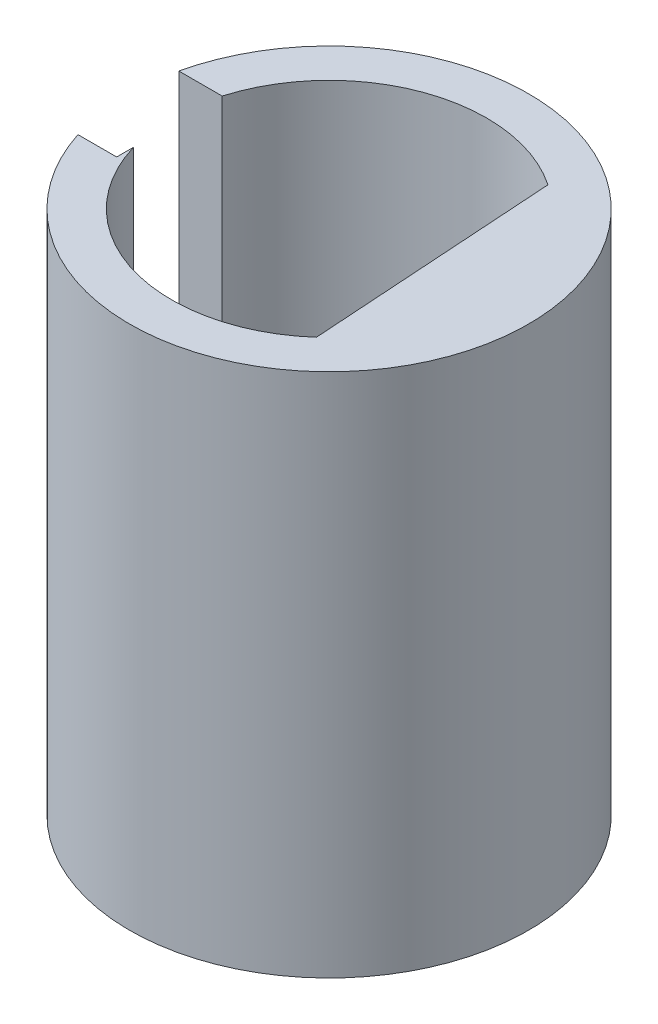
ISO-10303-21;
HEADER;
FILE_DESCRIPTION(('STEP AP214'),'2;1');
FILE_NAME('part.step','',(''),(''),'','','');
FILE_SCHEMA(('AUTOMOTIVE_DESIGN { 1 0 10303 214 1 1 1 1 }'));
ENDSEC;
DATA;
#1=APPLICATION_CONTEXT('core data for automotive mechanical design processes');
#2=APPLICATION_PROTOCOL_DEFINITION('international standard','automotive_design',2000,#1);
#3=PRODUCT_CONTEXT('',#1,'mechanical');
#4=PRODUCT('Part','Part','',(#3));
#5=PRODUCT_RELATED_PRODUCT_CATEGORY('part','',(#4));
#6=PRODUCT_DEFINITION_FORMATION('','',#4);
#7=PRODUCT_DEFINITION_CONTEXT('part definition',#1,'design');
#8=PRODUCT_DEFINITION('design','',#6,#7);
#9=PRODUCT_DEFINITION_SHAPE('','',#8);
#10=(LENGTH_UNIT() NAMED_UNIT(*) SI_UNIT(.MILLI.,.METRE.));
#11=(NAMED_UNIT(*) PLANE_ANGLE_UNIT() SI_UNIT($,.RADIAN.));
#12=(NAMED_UNIT(*) SI_UNIT($,.STERADIAN.) SOLID_ANGLE_UNIT());
#13=UNCERTAINTY_MEASURE_WITH_UNIT(LENGTH_MEASURE(1.E-05),#10,'distance_accuracy_value','');
#14=(GEOMETRIC_REPRESENTATION_CONTEXT(3) GLOBAL_UNCERTAINTY_ASSIGNED_CONTEXT((#13)) GLOBAL_UNIT_ASSIGNED_CONTEXT((#10,
#11,#12)) REPRESENTATION_CONTEXT('',''));
#15=CARTESIAN_POINT('',(0.,0.,0.));
#16=DIRECTION('',(0.,0.,1.));
#17=DIRECTION('',(1.,0.,0.));
#18=AXIS2_PLACEMENT_3D('',#15,#16,#17);
#19=CARTESIAN_POINT('',(0.,10.,0.));
#20=DIRECTION('',(0.,-1.,0.));
#21=DIRECTION('',(0.,0.,-1.));
#22=AXIS2_PLACEMENT_3D('',#19,#20,#21);
#23=CYLINDRICAL_SURFACE('',#22,3.);
#24=DIRECTION('',(0.,-1.,0.));
#25=VECTOR('',#24,1.);
#26=CARTESIAN_POINT('',(-2.87906674201422,10.,0.843193154044553));
#27=LINE('',#26,#25);
#28=CARTESIAN_POINT('',(-2.87906674201422,10.,0.843193154044552));
#29=VERTEX_POINT('',#28);
#30=CARTESIAN_POINT('',(-2.87906674201422,0.,0.843193154044553));
#31=VERTEX_POINT('',#30);
#32=EDGE_CURVE('E123',#29,#31,#27,.T.);
#33=ORIENTED_EDGE('',*,*,#32,.F.);
#34=CARTESIAN_POINT('',(0.,10.,0.));
#35=DIRECTION('',(0.,1.,0.));
#36=DIRECTION('',(0.,0.,1.));
#37=AXIS2_PLACEMENT_3D('',#34,#35,#36);
#38=CIRCLE('',#37,3.);
#39=CARTESIAN_POINT('',(1.99700776947787,10.,2.23874071045421));
#40=VERTEX_POINT('',#39);
#41=EDGE_CURVE('E118',#29,#40,#38,.T.);
#42=ORIENTED_EDGE('',*,*,#41,.T.);
#43=DIRECTION('',(0.,-1.,0.));
#44=VECTOR('',#43,1.);
#45=CARTESIAN_POINT('',(1.99700776947787,10.,2.23874071045421));
#46=LINE('',#45,#44);
#47=CARTESIAN_POINT('',(1.99700776947787,0.,2.23874071045421));
#48=VERTEX_POINT('',#47);
#49=EDGE_CURVE('E127',#40,#48,#46,.T.);
#50=ORIENTED_EDGE('',*,*,#49,.T.);
#51=CARTESIAN_POINT('',(0.,0.,0.));
#52=DIRECTION('',(0.,1.,0.));
#53=DIRECTION('',(0.,0.,1.));
#54=AXIS2_PLACEMENT_3D('',#51,#52,#53);
#55=CIRCLE('',#54,3.);
#56=EDGE_CURVE('E131',#31,#48,#55,.T.);
#57=ORIENTED_EDGE('',*,*,#56,.F.);
#58=EDGE_LOOP('',(#33,#42,#50,#57));
#59=FACE_BOUND('',#58,.T.);
#60=ADVANCED_FACE('F35',(#59),#23,.F.);
#61=DIRECTION('',(0.,1.,0.));
#62=VECTOR('',#61,1.);
#63=CARTESIAN_POINT('',(-2.87906674201422,-4.,-0.843193154044552));
#64=LINE('',#63,#62);
#65=CARTESIAN_POINT('',(-2.87906674201422,0.,-0.843193154044552));
#66=VERTEX_POINT('',#65);
#67=CARTESIAN_POINT('',(-2.87906674201422,10.,-0.843193154044552));
#68=VERTEX_POINT('',#67);
#69=EDGE_CURVE('E92',#66,#68,#64,.T.);
#70=ORIENTED_EDGE('',*,*,#69,.F.);
#71=CARTESIAN_POINT('',(1.68733123208539,0.,-2.480506664621));
#72=VERTEX_POINT('',#71);
#73=EDGE_CURVE('E128',#72,#66,#55,.T.);
#74=ORIENTED_EDGE('',*,*,#73,.F.);
#75=DIRECTION('',(0.,-1.,0.));
#76=VECTOR('',#75,1.);
#77=CARTESIAN_POINT('',(1.68733123208539,10.,-2.480506664621));
#78=LINE('',#77,#76);
#79=CARTESIAN_POINT('',(1.68733123208539,10.,-2.480506664621));
#80=VERTEX_POINT('',#79);
#81=EDGE_CURVE('E116',#80,#72,#78,.T.);
#82=ORIENTED_EDGE('',*,*,#81,.F.);
#83=EDGE_CURVE('E109',#80,#68,#38,.T.);
#84=ORIENTED_EDGE('',*,*,#83,.T.);
#85=EDGE_LOOP('',(#70,#74,#82,#84));
#86=FACE_BOUND('',#85,.T.);
#87=ADVANCED_FACE('F37',(#86),#23,.F.);
#88=CARTESIAN_POINT('',(1.84216950078163,10.,-0.120882977083395));
#89=DIRECTION('',(-0.997853942574241,0.,0.0654790751999729));
#90=DIRECTION('',(0.0654790751999729,0.,0.997853942574241));
#91=AXIS2_PLACEMENT_3D('',#88,#89,#90);
#92=PLANE('',#91);
#93=DIRECTION('',(-0.0654790751999729,0.,-0.997853942574241));
#94=VECTOR('',#93,1.);
#95=CARTESIAN_POINT('',(1.84216950078163,0.,-0.120882977083395));
#96=LINE('',#95,#94);
#97=EDGE_CURVE('E130',#48,#72,#96,.T.);
#98=ORIENTED_EDGE('',*,*,#97,.F.);
#99=ORIENTED_EDGE('',*,*,#49,.F.);
#100=DIRECTION('',(-0.0654790751999729,0.,-0.997853942574241));
#101=VECTOR('',#100,1.);
#102=CARTESIAN_POINT('',(1.84216950078163,10.,-0.120882977083395));
#103=LINE('',#102,#101);
#104=EDGE_CURVE('E117',#40,#80,#103,.T.);
#105=ORIENTED_EDGE('',*,*,#104,.T.);
#106=ORIENTED_EDGE('',*,*,#81,.T.);
#107=EDGE_LOOP('',(#98,#99,#105,#106));
#108=FACE_BOUND('',#107,.T.);
#109=ADVANCED_FACE('F161',(#108),#92,.T.);
#110=CARTESIAN_POINT('',(0.,10.,0.));
#111=DIRECTION('',(0.,-1.,0.));
#112=DIRECTION('',(0.,0.,-1.));
#113=AXIS2_PLACEMENT_3D('',#110,#111,#112);
#114=CYLINDRICAL_SURFACE('',#113,3.8);
#115=CARTESIAN_POINT('',(0.,10.,0.));
#116=DIRECTION('',(0.,1.,0.));
#117=DIRECTION('',(0.,0.,1.));
#118=AXIS2_PLACEMENT_3D('',#115,#116,#117);
#119=CIRCLE('',#118,3.8);
#120=CARTESIAN_POINT('',(-3.61646944780919,10.,1.16668279024879));
#121=VERTEX_POINT('',#120);
#122=CARTESIAN_POINT('',(-3.70526993685648,10.,-0.843193154044552));
#123=VERTEX_POINT('',#122);
#124=EDGE_CURVE('E113',#121,#123,#119,.T.);
#125=ORIENTED_EDGE('',*,*,#124,.F.);
#126=DIRECTION('',(0.,-1.,0.));
#127=VECTOR('',#126,1.);
#128=CARTESIAN_POINT('',(-3.61646944780919,10.,1.16668279024879));
#129=LINE('',#128,#127);
#130=CARTESIAN_POINT('',(-3.61646944780919,0.,1.16668279024879));
#131=VERTEX_POINT('',#130);
#132=EDGE_CURVE('E146',#121,#131,#129,.T.);
#133=ORIENTED_EDGE('',*,*,#132,.T.);
#134=CARTESIAN_POINT('',(0.,0.,0.));
#135=DIRECTION('',(0.,1.,0.));
#136=DIRECTION('',(0.,0.,1.));
#137=AXIS2_PLACEMENT_3D('',#134,#135,#136);
#138=CIRCLE('',#137,3.8);
#139=CARTESIAN_POINT('',(-3.70526993685648,0.,-0.843193154044552));
#140=VERTEX_POINT('',#139);
#141=EDGE_CURVE('E121',#131,#140,#138,.T.);
#142=ORIENTED_EDGE('',*,*,#141,.T.);
#143=DIRECTION('',(0.,-1.,0.));
#144=VECTOR('',#143,1.);
#145=CARTESIAN_POINT('',(-3.70526993685648,10.,-0.843193154044552));
#146=LINE('',#145,#144);
#147=EDGE_CURVE('E58',#140,#123,#146,.F.);
#148=ORIENTED_EDGE('',*,*,#147,.T.);
#149=EDGE_LOOP('',(#125,#133,#142,#148));
#150=FACE_BOUND('',#149,.T.);
#151=ADVANCED_FACE('F148',(#150),#114,.T.);
#152=CARTESIAN_POINT('',(0.,10.,0.));
#153=DIRECTION('',(0.,1.,0.));
#154=DIRECTION('',(0.,0.,1.));
#155=AXIS2_PLACEMENT_3D('',#152,#153,#154);
#156=PLANE('',#155);
#157=DIRECTION('',(0.,0.,-1.));
#158=VECTOR('',#157,1.);
#159=CARTESIAN_POINT('',(-2.87906674201422,10.,-0.843193154044552));
#160=LINE('',#159,#158);
#161=CARTESIAN_POINT('',(-2.87906674201422,10.,1.16668279024879));
#162=VERTEX_POINT('',#161);
#163=EDGE_CURVE('E114',#162,#29,#160,.T.);
#164=ORIENTED_EDGE('',*,*,#163,.F.);
#165=DIRECTION('',(1.,0.,0.));
#166=VECTOR('',#165,1.);
#167=CARTESIAN_POINT('',(-2.87906674201422,10.,1.16668279024879));
#168=LINE('',#167,#166);
#169=EDGE_CURVE('E101',#121,#162,#168,.T.);
#170=ORIENTED_EDGE('',*,*,#169,.F.);
#171=ORIENTED_EDGE('',*,*,#124,.T.);
#172=DIRECTION('',(-1.,0.,0.));
#173=VECTOR('',#172,1.);
#174=CARTESIAN_POINT('',(-2.87906674201422,10.,-0.843193154044552));
#175=LINE('',#174,#173);
#176=EDGE_CURVE('E95',#68,#123,#175,.T.);
#177=ORIENTED_EDGE('',*,*,#176,.F.);
#178=ORIENTED_EDGE('',*,*,#83,.F.);
#179=ORIENTED_EDGE('',*,*,#104,.F.);
#180=ORIENTED_EDGE('',*,*,#41,.F.);
#181=EDGE_LOOP('',(#164,#170,#171,#177,#178,#179,#180));
#182=FACE_BOUND('',#181,.T.);
#183=ADVANCED_FACE('F107',(#182),#156,.T.);
#184=CARTESIAN_POINT('',(0.,0.,0.));
#185=DIRECTION('',(0.,1.,0.));
#186=DIRECTION('',(0.,0.,1.));
#187=AXIS2_PLACEMENT_3D('',#184,#185,#186);
#188=PLANE('',#187);
#189=DIRECTION('',(1.,0.,0.));
#190=VECTOR('',#189,1.);
#191=CARTESIAN_POINT('',(0.,0.,1.16668279024879));
#192=LINE('',#191,#190);
#193=CARTESIAN_POINT('',(-2.87906674201422,0.,1.16668279024879));
#194=VERTEX_POINT('',#193);
#195=EDGE_CURVE('E43',#131,#194,#192,.T.);
#196=ORIENTED_EDGE('',*,*,#195,.T.);
#197=DIRECTION('',(0.,0.,-1.));
#198=VECTOR('',#197,1.);
#199=CARTESIAN_POINT('',(-2.87906674201422,0.,0.));
#200=LINE('',#199,#198);
#201=EDGE_CURVE('E11',#194,#31,#200,.T.);
#202=ORIENTED_EDGE('',*,*,#201,.T.);
#203=ORIENTED_EDGE('',*,*,#56,.T.);
#204=ORIENTED_EDGE('',*,*,#97,.T.);
#205=ORIENTED_EDGE('',*,*,#73,.T.);
#206=DIRECTION('',(-1.,0.,0.));
#207=VECTOR('',#206,1.);
#208=CARTESIAN_POINT('',(0.,0.,-0.843193154044552));
#209=LINE('',#208,#207);
#210=EDGE_CURVE('E96',#66,#140,#209,.T.);
#211=ORIENTED_EDGE('',*,*,#210,.T.);
#212=ORIENTED_EDGE('',*,*,#141,.F.);
#213=EDGE_LOOP('',(#196,#202,#203,#204,#205,#211,#212));
#214=FACE_BOUND('',#213,.T.);
#215=ADVANCED_FACE('F142',(#214),#188,.F.);
#216=CARTESIAN_POINT('',(-2.87906674201422,-4.,-0.843193154044552));
#217=DIRECTION('',(0.,0.,-1.));
#218=DIRECTION('',(-1.,0.,0.));
#219=AXIS2_PLACEMENT_3D('',#216,#217,#218);
#220=PLANE('',#219);
#221=ORIENTED_EDGE('',*,*,#210,.F.);
#222=ORIENTED_EDGE('',*,*,#69,.T.);
#223=ORIENTED_EDGE('',*,*,#176,.T.);
#224=ORIENTED_EDGE('',*,*,#147,.F.);
#225=EDGE_LOOP('',(#221,#222,#223,#224));
#226=FACE_BOUND('',#225,.T.);
#227=ADVANCED_FACE('F94',(#226),#220,.F.);
#228=CARTESIAN_POINT('',(-2.87906674201422,-4.,1.16668279024879));
#229=DIRECTION('',(0.,0.,1.));
#230=DIRECTION('',(1.,0.,0.));
#231=AXIS2_PLACEMENT_3D('',#228,#229,#230);
#232=PLANE('',#231);
#233=ORIENTED_EDGE('',*,*,#169,.T.);
#234=DIRECTION('',(0.,1.,0.));
#235=VECTOR('',#234,1.);
#236=CARTESIAN_POINT('',(-2.87906674201422,-4.,1.16668279024879));
#237=LINE('',#236,#235);
#238=EDGE_CURVE('E50',#194,#162,#237,.T.);
#239=ORIENTED_EDGE('',*,*,#238,.F.);
#240=ORIENTED_EDGE('',*,*,#195,.F.);
#241=ORIENTED_EDGE('',*,*,#132,.F.);
#242=EDGE_LOOP('',(#233,#239,#240,#241));
#243=FACE_BOUND('',#242,.T.);
#244=ADVANCED_FACE('F145',(#243),#232,.F.);
#245=CARTESIAN_POINT('',(-2.87906674201422,-4.,-0.843193154044552));
#246=DIRECTION('',(1.,0.,0.));
#247=DIRECTION('',(0.,0.,-1.));
#248=AXIS2_PLACEMENT_3D('',#245,#246,#247);
#249=PLANE('',#248);
#250=ORIENTED_EDGE('',*,*,#32,.T.);
#251=ORIENTED_EDGE('',*,*,#201,.F.);
#252=ORIENTED_EDGE('',*,*,#238,.T.);
#253=ORIENTED_EDGE('',*,*,#163,.T.);
#254=EDGE_LOOP('',(#250,#251,#252,#253));
#255=FACE_BOUND('',#254,.T.);
#256=ADVANCED_FACE('F155',(#255),#249,.F.);
#257=CLOSED_SHELL('',(#60,#87,#109,#151,#183,#215,#227,#244,#256));
#258=MANIFOLD_SOLID_BREP('B2',#257);
#259=ADVANCED_BREP_SHAPE_REPRESENTATION('',(#18,#258),#14);
#260=SHAPE_DEFINITION_REPRESENTATION(#9,#259);
ENDSEC;
END-ISO-10303-21;
